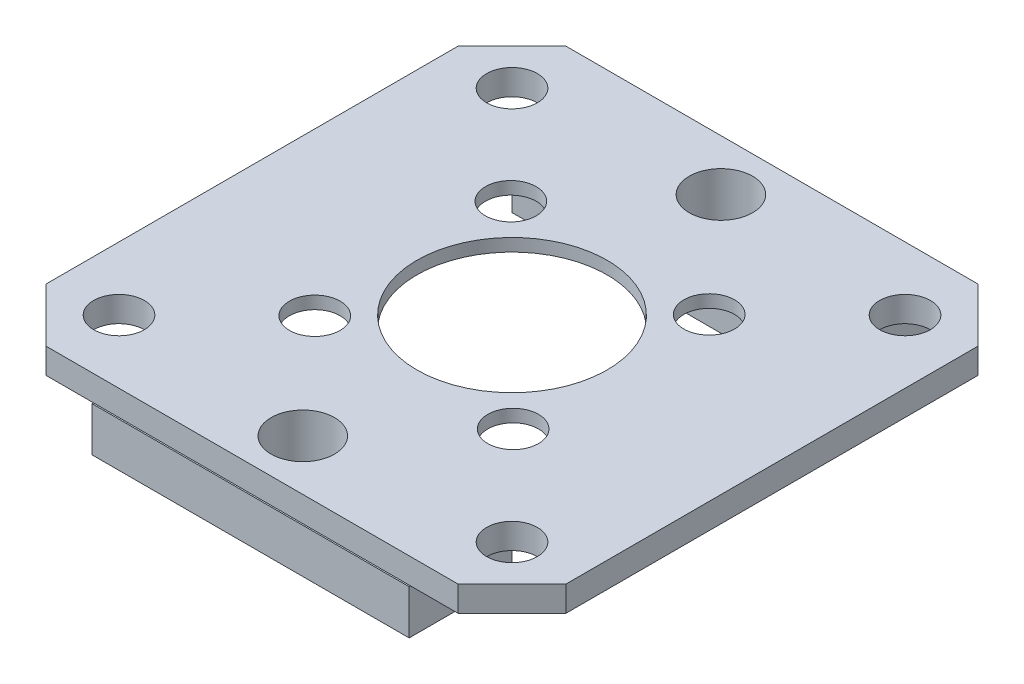
ISO-10303-21;
HEADER;
FILE_DESCRIPTION(('STEP AP214'),'2;1');
FILE_NAME('part.step','',(''),(''),'','','');
FILE_SCHEMA(('AUTOMOTIVE_DESIGN { 1 0 10303 214 1 1 1 1 }'));
ENDSEC;
DATA;
#1=APPLICATION_CONTEXT('core data for automotive mechanical design processes');
#2=APPLICATION_PROTOCOL_DEFINITION('international standard','automotive_design',2000,#1);
#3=PRODUCT_CONTEXT('',#1,'mechanical');
#4=PRODUCT('Part','Part','',(#3));
#5=PRODUCT_RELATED_PRODUCT_CATEGORY('part','',(#4));
#6=PRODUCT_DEFINITION_FORMATION('','',#4);
#7=PRODUCT_DEFINITION_CONTEXT('part definition',#1,'design');
#8=PRODUCT_DEFINITION('design','',#6,#7);
#9=PRODUCT_DEFINITION_SHAPE('','',#8);
#10=(LENGTH_UNIT() NAMED_UNIT(*) SI_UNIT(.MILLI.,.METRE.));
#11=(NAMED_UNIT(*) PLANE_ANGLE_UNIT() SI_UNIT($,.RADIAN.));
#12=(NAMED_UNIT(*) SI_UNIT($,.STERADIAN.) SOLID_ANGLE_UNIT());
#13=UNCERTAINTY_MEASURE_WITH_UNIT(LENGTH_MEASURE(1.E-05),#10,'distance_accuracy_value','');
#14=(GEOMETRIC_REPRESENTATION_CONTEXT(3) GLOBAL_UNCERTAINTY_ASSIGNED_CONTEXT((#13)) GLOBAL_UNIT_ASSIGNED_CONTEXT((#10,
#11,#12)) REPRESENTATION_CONTEXT('',''));
#15=CARTESIAN_POINT('',(0.,0.,0.));
#16=DIRECTION('',(0.,0.,1.));
#17=DIRECTION('',(1.,0.,0.));
#18=AXIS2_PLACEMENT_3D('',#15,#16,#17);
#19=CARTESIAN_POINT('',(0.,0.,0.));
#20=DIRECTION('',(0.,-1.,0.));
#21=DIRECTION('',(0.,0.,-1.));
#22=AXIS2_PLACEMENT_3D('',#19,#20,#21);
#23=PLANE('',#22);
#24=CARTESIAN_POINT('',(-15.5,0.,-15.5));
#25=DIRECTION('',(0.,-1.,0.));
#26=DIRECTION('',(0.,0.,-1.));
#27=AXIS2_PLACEMENT_3D('',#24,#25,#26);
#28=CIRCLE('',#27,2.);
#29=CARTESIAN_POINT('',(-15.5,0.,-17.5));
#30=VERTEX_POINT('',#29);
#31=EDGE_CURVE('E250',#30,#30,#28,.T.);
#32=ORIENTED_EDGE('',*,*,#31,.F.);
#33=EDGE_LOOP('',(#32));
#34=FACE_BOUND('',#33,.T.);
#35=CARTESIAN_POINT('',(15.5,0.,-15.5));
#36=DIRECTION('',(0.,-1.,0.));
#37=DIRECTION('',(0.,0.,-1.));
#38=AXIS2_PLACEMENT_3D('',#35,#36,#37);
#39=CIRCLE('',#38,2.);
#40=CARTESIAN_POINT('',(15.5,0.,-17.5));
#41=VERTEX_POINT('',#40);
#42=EDGE_CURVE('E244',#41,#41,#39,.T.);
#43=ORIENTED_EDGE('',*,*,#42,.F.);
#44=EDGE_LOOP('',(#43));
#45=FACE_BOUND('',#44,.T.);
#46=CARTESIAN_POINT('',(15.5,0.,15.5));
#47=DIRECTION('',(0.,-1.,0.));
#48=DIRECTION('',(0.,0.,-1.));
#49=AXIS2_PLACEMENT_3D('',#46,#47,#48);
#50=CIRCLE('',#49,2.);
#51=CARTESIAN_POINT('',(15.5,0.,13.5));
#52=VERTEX_POINT('',#51);
#53=EDGE_CURVE('E237',#52,#52,#50,.T.);
#54=ORIENTED_EDGE('',*,*,#53,.F.);
#55=EDGE_LOOP('',(#54));
#56=FACE_BOUND('',#55,.T.);
#57=CARTESIAN_POINT('',(-15.5,0.,15.5));
#58=DIRECTION('',(0.,-1.,0.));
#59=DIRECTION('',(0.,0.,-1.));
#60=AXIS2_PLACEMENT_3D('',#57,#58,#59);
#61=CIRCLE('',#60,2.);
#62=CARTESIAN_POINT('',(-15.5,0.,13.5));
#63=VERTEX_POINT('',#62);
#64=EDGE_CURVE('E240',#63,#63,#61,.T.);
#65=ORIENTED_EDGE('',*,*,#64,.F.);
#66=EDGE_LOOP('',(#65));
#67=FACE_BOUND('',#66,.T.);
#68=DIRECTION('',(0.,0.,-1.));
#69=VECTOR('',#68,1.);
#70=CARTESIAN_POINT('',(-12.5,0.,-12.5));
#71=LINE('',#70,#69);
#72=CARTESIAN_POINT('',(-12.5,0.,12.5));
#73=VERTEX_POINT('',#72);
#74=CARTESIAN_POINT('',(-12.5,0.,-12.5));
#75=VERTEX_POINT('',#74);
#76=EDGE_CURVE('E302',#73,#75,#71,.T.);
#77=ORIENTED_EDGE('',*,*,#76,.F.);
#78=DIRECTION('',(0.,0.,-1.));
#79=VECTOR('',#78,1.);
#80=CARTESIAN_POINT('',(-12.5,0.,12.5));
#81=LINE('',#80,#79);
#82=CARTESIAN_POINT('',(-12.5,0.,20.5));
#83=VERTEX_POINT('',#82);
#84=EDGE_CURVE('E197',#83,#73,#81,.T.);
#85=ORIENTED_EDGE('',*,*,#84,.F.);
#86=DIRECTION('',(1.,0.,0.));
#87=VECTOR('',#86,1.);
#88=CARTESIAN_POINT('',(-20.5,0.,20.5));
#89=LINE('',#88,#87);
#90=CARTESIAN_POINT('',(-16.2573593128807,0.,20.5));
#91=VERTEX_POINT('',#90);
#92=EDGE_CURVE('E358',#91,#83,#89,.T.);
#93=ORIENTED_EDGE('',*,*,#92,.F.);
#94=DIRECTION('',(-0.707106781186549,0.,-0.707106781186546));
#95=VECTOR('',#94,1.);
#96=CARTESIAN_POINT('',(-16.2573593128807,0.,20.5));
#97=LINE('',#96,#95);
#98=CARTESIAN_POINT('',(-20.5,0.,16.2573593128807));
#99=VERTEX_POINT('',#98);
#100=EDGE_CURVE('E285',#91,#99,#97,.T.);
#101=ORIENTED_EDGE('',*,*,#100,.T.);
#102=DIRECTION('',(0.,0.,1.));
#103=VECTOR('',#102,1.);
#104=CARTESIAN_POINT('',(-20.5,0.,20.5));
#105=LINE('',#104,#103);
#106=CARTESIAN_POINT('',(-20.5,0.,-16.2573593128807));
#107=VERTEX_POINT('',#106);
#108=EDGE_CURVE('E368',#107,#99,#105,.T.);
#109=ORIENTED_EDGE('',*,*,#108,.F.);
#110=DIRECTION('',(0.707106781186546,0.,-0.707106781186549));
#111=VECTOR('',#110,1.);
#112=CARTESIAN_POINT('',(-20.5,0.,-16.2573593128807));
#113=LINE('',#112,#111);
#114=CARTESIAN_POINT('',(-16.2573593128807,0.,-20.5));
#115=VERTEX_POINT('',#114);
#116=EDGE_CURVE('E291',#107,#115,#113,.T.);
#117=ORIENTED_EDGE('',*,*,#116,.T.);
#118=DIRECTION('',(-1.,0.,0.));
#119=VECTOR('',#118,1.);
#120=CARTESIAN_POINT('',(-20.5,0.,-20.5));
#121=LINE('',#120,#119);
#122=CARTESIAN_POINT('',(16.2573593128807,0.,-20.5));
#123=VERTEX_POINT('',#122);
#124=EDGE_CURVE('E365',#123,#115,#121,.T.);
#125=ORIENTED_EDGE('',*,*,#124,.F.);
#126=DIRECTION('',(0.707106781186549,0.,0.707106781186546));
#127=VECTOR('',#126,1.);
#128=CARTESIAN_POINT('',(16.2573593128807,0.,-20.5));
#129=LINE('',#128,#127);
#130=CARTESIAN_POINT('',(20.5,0.,-16.2573593128807));
#131=VERTEX_POINT('',#130);
#132=EDGE_CURVE('E263',#123,#131,#129,.T.);
#133=ORIENTED_EDGE('',*,*,#132,.T.);
#134=DIRECTION('',(0.,0.,-1.));
#135=VECTOR('',#134,1.);
#136=CARTESIAN_POINT('',(20.5,0.,20.5));
#137=LINE('',#136,#135);
#138=CARTESIAN_POINT('',(20.5,0.,16.2573593128807));
#139=VERTEX_POINT('',#138);
#140=EDGE_CURVE('E353',#139,#131,#137,.T.);
#141=ORIENTED_EDGE('',*,*,#140,.F.);
#142=DIRECTION('',(-0.707106781186546,0.,0.707106781186549));
#143=VECTOR('',#142,1.);
#144=CARTESIAN_POINT('',(20.5,0.,16.2573593128807));
#145=LINE('',#144,#143);
#146=CARTESIAN_POINT('',(16.2573593128807,0.,20.5));
#147=VERTEX_POINT('',#146);
#148=EDGE_CURVE('E275',#139,#147,#145,.T.);
#149=ORIENTED_EDGE('',*,*,#148,.T.);
#150=CARTESIAN_POINT('',(12.5,0.,20.5));
#151=VERTEX_POINT('',#150);
#152=EDGE_CURVE('E370',#151,#147,#89,.T.);
#153=ORIENTED_EDGE('',*,*,#152,.F.);
#154=DIRECTION('',(0.,0.,1.));
#155=VECTOR('',#154,1.);
#156=CARTESIAN_POINT('',(12.5,0.,12.5));
#157=LINE('',#156,#155);
#158=CARTESIAN_POINT('',(12.5,0.,12.5));
#159=VERTEX_POINT('',#158);
#160=EDGE_CURVE('E201',#159,#151,#157,.T.);
#161=ORIENTED_EDGE('',*,*,#160,.F.);
#162=DIRECTION('',(0.,0.,1.));
#163=VECTOR('',#162,1.);
#164=CARTESIAN_POINT('',(12.5,0.,-12.5));
#165=LINE('',#164,#163);
#166=CARTESIAN_POINT('',(12.5,0.,-12.5));
#167=VERTEX_POINT('',#166);
#168=EDGE_CURVE('E296',#167,#159,#165,.T.);
#169=ORIENTED_EDGE('',*,*,#168,.F.);
#170=DIRECTION('',(0.,0.,1.));
#171=VECTOR('',#170,1.);
#172=CARTESIAN_POINT('',(12.5,0.,-12.5));
#173=LINE('',#172,#171);
#174=CARTESIAN_POINT('',(12.5,0.,-20.457817611367));
#175=VERTEX_POINT('',#174);
#176=EDGE_CURVE('E214',#175,#167,#173,.T.);
#177=ORIENTED_EDGE('',*,*,#176,.F.);
#178=DIRECTION('',(1.,0.,0.));
#179=VECTOR('',#178,1.);
#180=CARTESIAN_POINT('',(12.5,0.,-20.457817611367));
#181=LINE('',#180,#179);
#182=CARTESIAN_POINT('',(-12.5,0.,-20.457817611367));
#183=VERTEX_POINT('',#182);
#184=EDGE_CURVE('E54',#183,#175,#181,.T.);
#185=ORIENTED_EDGE('',*,*,#184,.F.);
#186=DIRECTION('',(0.,0.,-1.));
#187=VECTOR('',#186,1.);
#188=CARTESIAN_POINT('',(-12.5,0.,-12.5));
#189=LINE('',#188,#187);
#190=EDGE_CURVE('E199',#75,#183,#189,.T.);
#191=ORIENTED_EDGE('',*,*,#190,.F.);
#192=EDGE_LOOP('',(#77,#85,#93,#101,#109,#117,#125,#133,#141,#149,#153,#161,#169,#177,#185,#191));
#193=FACE_BOUND('',#192,.T.);
#194=ADVANCED_FACE('F37',(#34,#45,#56,#67,#193),#23,.T.);
#195=CARTESIAN_POINT('',(20.5,2.,20.5));
#196=DIRECTION('',(-1.,0.,0.));
#197=DIRECTION('',(0.,0.,1.));
#198=AXIS2_PLACEMENT_3D('',#195,#196,#197);
#199=PLANE('',#198);
#200=DIRECTION('',(0.,0.,-1.));
#201=VECTOR('',#200,1.);
#202=CARTESIAN_POINT('',(20.5,2.,20.5));
#203=LINE('',#202,#201);
#204=CARTESIAN_POINT('',(20.5,2.,16.2573593128807));
#205=VERTEX_POINT('',#204);
#206=CARTESIAN_POINT('',(20.5,2.,-16.2573593128807));
#207=VERTEX_POINT('',#206);
#208=EDGE_CURVE('E354',#205,#207,#203,.T.);
#209=ORIENTED_EDGE('',*,*,#208,.F.);
#210=DIRECTION('',(0.,1.,0.));
#211=VECTOR('',#210,1.);
#212=CARTESIAN_POINT('',(20.5,0.,16.2573593128807));
#213=LINE('',#212,#211);
#214=EDGE_CURVE('E273',#139,#205,#213,.T.);
#215=ORIENTED_EDGE('',*,*,#214,.F.);
#216=ORIENTED_EDGE('',*,*,#140,.T.);
#217=DIRECTION('',(0.,1.,0.));
#218=VECTOR('',#217,1.);
#219=CARTESIAN_POINT('',(20.5,0.,-16.2573593128807));
#220=LINE('',#219,#218);
#221=EDGE_CURVE('E264',#131,#207,#220,.T.);
#222=ORIENTED_EDGE('',*,*,#221,.T.);
#223=EDGE_LOOP('',(#209,#215,#216,#222));
#224=FACE_BOUND('',#223,.T.);
#225=ADVANCED_FACE('F39',(#224),#199,.F.);
#226=CARTESIAN_POINT('',(-20.5,2.,-20.5));
#227=DIRECTION('',(0.,0.,1.));
#228=DIRECTION('',(1.,0.,0.));
#229=AXIS2_PLACEMENT_3D('',#226,#227,#228);
#230=PLANE('',#229);
#231=DIRECTION('',(-1.,0.,0.));
#232=VECTOR('',#231,1.);
#233=CARTESIAN_POINT('',(-20.5,2.,-20.5));
#234=LINE('',#233,#232);
#235=CARTESIAN_POINT('',(16.2573593128807,2.,-20.5));
#236=VERTEX_POINT('',#235);
#237=CARTESIAN_POINT('',(-16.2573593128807,2.,-20.5));
#238=VERTEX_POINT('',#237);
#239=EDGE_CURVE('E357',#236,#238,#234,.T.);
#240=ORIENTED_EDGE('',*,*,#239,.F.);
#241=DIRECTION('',(0.,1.,0.));
#242=VECTOR('',#241,1.);
#243=CARTESIAN_POINT('',(16.2573593128807,0.,-20.5));
#244=LINE('',#243,#242);
#245=EDGE_CURVE('E261',#123,#236,#244,.T.);
#246=ORIENTED_EDGE('',*,*,#245,.F.);
#247=ORIENTED_EDGE('',*,*,#124,.T.);
#248=DIRECTION('',(0.,1.,0.));
#249=VECTOR('',#248,1.);
#250=CARTESIAN_POINT('',(-16.2573593128807,0.,-20.5));
#251=LINE('',#250,#249);
#252=EDGE_CURVE('E62',#115,#238,#251,.T.);
#253=ORIENTED_EDGE('',*,*,#252,.T.);
#254=EDGE_LOOP('',(#240,#246,#247,#253));
#255=FACE_BOUND('',#254,.T.);
#256=ADVANCED_FACE('F490',(#255),#230,.F.);
#257=CARTESIAN_POINT('',(-20.5,2.,20.5));
#258=DIRECTION('',(1.,0.,0.));
#259=DIRECTION('',(0.,0.,-1.));
#260=AXIS2_PLACEMENT_3D('',#257,#258,#259);
#261=PLANE('',#260);
#262=ORIENTED_EDGE('',*,*,#108,.T.);
#263=DIRECTION('',(0.,1.,0.));
#264=VECTOR('',#263,1.);
#265=CARTESIAN_POINT('',(-20.5,0.,16.2573593128807));
#266=LINE('',#265,#264);
#267=CARTESIAN_POINT('',(-20.5,2.,16.2573593128807));
#268=VERTEX_POINT('',#267);
#269=EDGE_CURVE('E258',#99,#268,#266,.T.);
#270=ORIENTED_EDGE('',*,*,#269,.T.);
#271=DIRECTION('',(0.,0.,1.));
#272=VECTOR('',#271,1.);
#273=CARTESIAN_POINT('',(-20.5,2.,20.5));
#274=LINE('',#273,#272);
#275=CARTESIAN_POINT('',(-20.5,2.,-16.2573593128807));
#276=VERTEX_POINT('',#275);
#277=EDGE_CURVE('E46',#276,#268,#274,.T.);
#278=ORIENTED_EDGE('',*,*,#277,.F.);
#279=DIRECTION('',(0.,1.,0.));
#280=VECTOR('',#279,1.);
#281=CARTESIAN_POINT('',(-20.5,0.,-16.2573593128807));
#282=LINE('',#281,#280);
#283=EDGE_CURVE('E293',#107,#276,#282,.T.);
#284=ORIENTED_EDGE('',*,*,#283,.F.);
#285=EDGE_LOOP('',(#262,#270,#278,#284));
#286=FACE_BOUND('',#285,.T.);
#287=ADVANCED_FACE('F480',(#286),#261,.F.);
#288=CARTESIAN_POINT('',(-20.5,2.,20.5));
#289=DIRECTION('',(0.,0.,-1.));
#290=DIRECTION('',(-1.,0.,0.));
#291=AXIS2_PLACEMENT_3D('',#288,#289,#290);
#292=PLANE('',#291);
#293=DIRECTION('',(1.,0.,0.));
#294=VECTOR('',#293,1.);
#295=CARTESIAN_POINT('',(-20.5,2.,20.5));
#296=LINE('',#295,#294);
#297=CARTESIAN_POINT('',(-16.2573593128807,2.,20.5));
#298=VERTEX_POINT('',#297);
#299=CARTESIAN_POINT('',(16.2573593128807,2.,20.5));
#300=VERTEX_POINT('',#299);
#301=EDGE_CURVE('E11',#298,#300,#296,.T.);
#302=ORIENTED_EDGE('',*,*,#301,.F.);
#303=DIRECTION('',(0.,1.,0.));
#304=VECTOR('',#303,1.);
#305=CARTESIAN_POINT('',(-16.2573593128807,0.,20.5));
#306=LINE('',#305,#304);
#307=EDGE_CURVE('E283',#91,#298,#306,.T.);
#308=ORIENTED_EDGE('',*,*,#307,.F.);
#309=ORIENTED_EDGE('',*,*,#92,.T.);
#310=DIRECTION('',(1.,0.,0.));
#311=VECTOR('',#310,1.);
#312=CARTESIAN_POINT('',(-20.5,0.,20.5));
#313=LINE('',#312,#311);
#314=EDGE_CURVE('E196',#83,#151,#313,.T.);
#315=ORIENTED_EDGE('',*,*,#314,.T.);
#316=ORIENTED_EDGE('',*,*,#152,.T.);
#317=DIRECTION('',(0.,1.,0.));
#318=VECTOR('',#317,1.);
#319=CARTESIAN_POINT('',(16.2573593128807,0.,20.5));
#320=LINE('',#319,#318);
#321=EDGE_CURVE('E276',#147,#300,#320,.T.);
#322=ORIENTED_EDGE('',*,*,#321,.T.);
#323=EDGE_LOOP('',(#302,#308,#309,#315,#316,#322));
#324=FACE_BOUND('',#323,.T.);
#325=ADVANCED_FACE('F378',(#324),#292,.F.);
#326=CARTESIAN_POINT('',(0.,2.,0.));
#327=DIRECTION('',(0.,-1.,0.));
#328=DIRECTION('',(0.,0.,-1.));
#329=AXIS2_PLACEMENT_3D('',#326,#327,#328);
#330=PLANE('',#329);
#331=CARTESIAN_POINT('',(0.,2.,16.5));
#332=DIRECTION('',(0.,-1.,0.));
#333=DIRECTION('',(0.,0.,-1.));
#334=AXIS2_PLACEMENT_3D('',#331,#332,#333);
#335=CIRCLE('',#334,2.5);
#336=CARTESIAN_POINT('',(0.,2.,14.));
#337=VERTEX_POINT('',#336);
#338=EDGE_CURVE('E404',#337,#337,#335,.T.);
#339=ORIENTED_EDGE('',*,*,#338,.T.);
#340=EDGE_LOOP('',(#339));
#341=FACE_BOUND('',#340,.T.);
#342=CARTESIAN_POINT('',(0.,2.,-16.4789088056835));
#343=DIRECTION('',(0.,-1.,0.));
#344=DIRECTION('',(0.,0.,-1.));
#345=AXIS2_PLACEMENT_3D('',#342,#343,#344);
#346=CIRCLE('',#345,2.5);
#347=CARTESIAN_POINT('',(0.,2.,-18.9789088056835));
#348=VERTEX_POINT('',#347);
#349=EDGE_CURVE('E411',#348,#348,#346,.T.);
#350=ORIENTED_EDGE('',*,*,#349,.T.);
#351=EDGE_LOOP('',(#350));
#352=FACE_BOUND('',#351,.T.);
#353=CARTESIAN_POINT('',(-15.5,2.,-15.5));
#354=DIRECTION('',(0.,-1.,0.));
#355=DIRECTION('',(0.,0.,-1.));
#356=AXIS2_PLACEMENT_3D('',#353,#354,#355);
#357=CIRCLE('',#356,2.);
#358=CARTESIAN_POINT('',(-15.5,2.,-17.5));
#359=VERTEX_POINT('',#358);
#360=EDGE_CURVE('E236',#359,#359,#357,.T.);
#361=ORIENTED_EDGE('',*,*,#360,.T.);
#362=EDGE_LOOP('',(#361));
#363=FACE_BOUND('',#362,.T.);
#364=CARTESIAN_POINT('',(15.5,2.,-15.5));
#365=DIRECTION('',(0.,-1.,0.));
#366=DIRECTION('',(0.,0.,-1.));
#367=AXIS2_PLACEMENT_3D('',#364,#365,#366);
#368=CIRCLE('',#367,2.);
#369=CARTESIAN_POINT('',(15.5,2.,-17.5));
#370=VERTEX_POINT('',#369);
#371=EDGE_CURVE('E247',#370,#370,#368,.T.);
#372=ORIENTED_EDGE('',*,*,#371,.T.);
#373=EDGE_LOOP('',(#372));
#374=FACE_BOUND('',#373,.T.);
#375=CARTESIAN_POINT('',(15.5,2.,15.5));
#376=DIRECTION('',(0.,-1.,0.));
#377=DIRECTION('',(0.,0.,-1.));
#378=AXIS2_PLACEMENT_3D('',#375,#376,#377);
#379=CIRCLE('',#378,2.);
#380=CARTESIAN_POINT('',(15.5,2.,13.5));
#381=VERTEX_POINT('',#380);
#382=EDGE_CURVE('E241',#381,#381,#379,.T.);
#383=ORIENTED_EDGE('',*,*,#382,.T.);
#384=EDGE_LOOP('',(#383));
#385=FACE_BOUND('',#384,.T.);
#386=CARTESIAN_POINT('',(-15.5,2.,15.5));
#387=DIRECTION('',(0.,-1.,0.));
#388=DIRECTION('',(0.,0.,-1.));
#389=AXIS2_PLACEMENT_3D('',#386,#387,#388);
#390=CIRCLE('',#389,2.);
#391=CARTESIAN_POINT('',(-15.5,2.,13.5));
#392=VERTEX_POINT('',#391);
#393=EDGE_CURVE('E255',#392,#392,#390,.T.);
#394=ORIENTED_EDGE('',*,*,#393,.T.);
#395=EDGE_LOOP('',(#394));
#396=FACE_BOUND('',#395,.T.);
#397=CARTESIAN_POINT('',(0.,2.,0.));
#398=DIRECTION('',(0.,1.,0.));
#399=DIRECTION('',(0.,0.,1.));
#400=AXIS2_PLACEMENT_3D('',#397,#398,#399);
#401=CIRCLE('',#400,7.5);
#402=CARTESIAN_POINT('',(0.,2.,7.5));
#403=VERTEX_POINT('',#402);
#404=EDGE_CURVE('E338',#403,#403,#401,.T.);
#405=ORIENTED_EDGE('',*,*,#404,.F.);
#406=EDGE_LOOP('',(#405));
#407=FACE_BOUND('',#406,.T.);
#408=CARTESIAN_POINT('',(-7.82377924600726,2.,-7.73230097123404));
#409=DIRECTION('',(0.,-1.,0.));
#410=DIRECTION('',(0.,0.,-1.));
#411=AXIS2_PLACEMENT_3D('',#408,#409,#410);
#412=CIRCLE('',#411,2.);
#413=CARTESIAN_POINT('',(-7.82377924600726,2.,-9.73230097123404));
#414=VERTEX_POINT('',#413);
#415=EDGE_CURVE('E341',#414,#414,#412,.T.);
#416=ORIENTED_EDGE('',*,*,#415,.T.);
#417=EDGE_LOOP('',(#416));
#418=FACE_BOUND('',#417,.T.);
#419=CARTESIAN_POINT('',(7.73230097123402,2.,-7.82377924600729));
#420=DIRECTION('',(0.,-1.,0.));
#421=DIRECTION('',(0.,0.,-1.));
#422=AXIS2_PLACEMENT_3D('',#419,#420,#421);
#423=CIRCLE('',#422,2.);
#424=CARTESIAN_POINT('',(7.73230097123402,2.,-9.82377924600729));
#425=VERTEX_POINT('',#424);
#426=EDGE_CURVE('E346',#425,#425,#423,.T.);
#427=ORIENTED_EDGE('',*,*,#426,.T.);
#428=EDGE_LOOP('',(#427));
#429=FACE_BOUND('',#428,.T.);
#430=CARTESIAN_POINT('',(7.82377924600726,2.,7.73230097123398));
#431=DIRECTION('',(0.,-1.,0.));
#432=DIRECTION('',(0.,0.,-1.));
#433=AXIS2_PLACEMENT_3D('',#430,#431,#432);
#434=CIRCLE('',#433,2.);
#435=CARTESIAN_POINT('',(7.82377924600726,2.,5.73230097123398));
#436=VERTEX_POINT('',#435);
#437=EDGE_CURVE('E342',#436,#436,#434,.T.);
#438=ORIENTED_EDGE('',*,*,#437,.T.);
#439=EDGE_LOOP('',(#438));
#440=FACE_BOUND('',#439,.T.);
#441=CARTESIAN_POINT('',(-7.73230097123401,2.,7.82377924600724));
#442=DIRECTION('',(0.,-1.,0.));
#443=DIRECTION('',(0.,0.,-1.));
#444=AXIS2_PLACEMENT_3D('',#441,#442,#443);
#445=CIRCLE('',#444,2.);
#446=CARTESIAN_POINT('',(-7.73230097123401,2.,5.82377924600724));
#447=VERTEX_POINT('',#446);
#448=EDGE_CURVE('E345',#447,#447,#445,.T.);
#449=ORIENTED_EDGE('',*,*,#448,.T.);
#450=EDGE_LOOP('',(#449));
#451=FACE_BOUND('',#450,.T.);
#452=ORIENTED_EDGE('',*,*,#277,.T.);
#453=DIRECTION('',(-0.707106781186549,0.,-0.707106781186546));
#454=VECTOR('',#453,1.);
#455=CARTESIAN_POINT('',(-16.2573593128807,2.,20.5));
#456=LINE('',#455,#454);
#457=EDGE_CURVE('E279',#298,#268,#456,.T.);
#458=ORIENTED_EDGE('',*,*,#457,.F.);
#459=ORIENTED_EDGE('',*,*,#301,.T.);
#460=DIRECTION('',(-0.707106781186546,0.,0.707106781186549));
#461=VECTOR('',#460,1.);
#462=CARTESIAN_POINT('',(20.5,2.,16.2573593128807));
#463=LINE('',#462,#461);
#464=EDGE_CURVE('E267',#205,#300,#463,.T.);
#465=ORIENTED_EDGE('',*,*,#464,.F.);
#466=ORIENTED_EDGE('',*,*,#208,.T.);
#467=DIRECTION('',(0.707106781186549,0.,0.707106781186546));
#468=VECTOR('',#467,1.);
#469=CARTESIAN_POINT('',(16.2573593128807,2.,-20.5));
#470=LINE('',#469,#468);
#471=EDGE_CURVE('E268',#236,#207,#470,.T.);
#472=ORIENTED_EDGE('',*,*,#471,.F.);
#473=ORIENTED_EDGE('',*,*,#239,.T.);
#474=DIRECTION('',(0.707106781186546,0.,-0.707106781186549));
#475=VECTOR('',#474,1.);
#476=CARTESIAN_POINT('',(-20.5,2.,-16.2573593128807));
#477=LINE('',#476,#475);
#478=EDGE_CURVE('E270',#276,#238,#477,.T.);
#479=ORIENTED_EDGE('',*,*,#478,.F.);
#480=EDGE_LOOP('',(#452,#458,#459,#465,#466,#472,#473,#479));
#481=FACE_BOUND('',#480,.T.);
#482=ADVANCED_FACE('F390',(#341,#352,#363,#374,#385,#396,#407,#418,#429,#440,#451,#481),#330,.F.);
#483=CARTESIAN_POINT('',(-7.73230097123401,2.,7.82377924600724));
#484=DIRECTION('',(0.,-1.,0.));
#485=DIRECTION('',(0.,0.,-1.));
#486=AXIS2_PLACEMENT_3D('',#483,#484,#485);
#487=CYLINDRICAL_SURFACE('',#486,2.);
#488=CARTESIAN_POINT('',(-7.73230097123401,1.,7.82377924600724));
#489=DIRECTION('',(0.,1.,0.));
#490=DIRECTION('',(0.,0.,1.));
#491=AXIS2_PLACEMENT_3D('',#488,#489,#490);
#492=CIRCLE('',#491,2.);
#493=CARTESIAN_POINT('',(-7.73230097123401,1.,9.82377924600724));
#494=VERTEX_POINT('',#493);
#495=EDGE_CURVE('E335',#494,#494,#492,.F.);
#496=ORIENTED_EDGE('',*,*,#495,.T.);
#497=EDGE_LOOP('',(#496));
#498=FACE_BOUND('',#497,.T.);
#499=ORIENTED_EDGE('',*,*,#448,.F.);
#500=EDGE_LOOP('',(#499));
#501=FACE_BOUND('',#500,.T.);
#502=ADVANCED_FACE('F465',(#498,#501),#487,.F.);
#503=CARTESIAN_POINT('',(7.82377924600726,2.,7.73230097123398));
#504=DIRECTION('',(0.,-1.,0.));
#505=DIRECTION('',(0.,0.,-1.));
#506=AXIS2_PLACEMENT_3D('',#503,#504,#505);
#507=CYLINDRICAL_SURFACE('',#506,2.);
#508=CARTESIAN_POINT('',(7.82377924600726,1.,7.73230097123398));
#509=DIRECTION('',(0.,1.,0.));
#510=DIRECTION('',(0.,0.,1.));
#511=AXIS2_PLACEMENT_3D('',#508,#509,#510);
#512=CIRCLE('',#511,2.);
#513=CARTESIAN_POINT('',(7.82377924600726,1.,9.73230097123398));
#514=VERTEX_POINT('',#513);
#515=EDGE_CURVE('E332',#514,#514,#512,.F.);
#516=ORIENTED_EDGE('',*,*,#515,.T.);
#517=EDGE_LOOP('',(#516));
#518=FACE_BOUND('',#517,.T.);
#519=ORIENTED_EDGE('',*,*,#437,.F.);
#520=EDGE_LOOP('',(#519));
#521=FACE_BOUND('',#520,.T.);
#522=ADVANCED_FACE('F468',(#518,#521),#507,.F.);
#523=CARTESIAN_POINT('',(7.73230097123402,2.,-7.82377924600729));
#524=DIRECTION('',(0.,-1.,0.));
#525=DIRECTION('',(0.,0.,-1.));
#526=AXIS2_PLACEMENT_3D('',#523,#524,#525);
#527=CYLINDRICAL_SURFACE('',#526,2.);
#528=CARTESIAN_POINT('',(7.73230097123402,1.,-7.82377924600729));
#529=DIRECTION('',(0.,1.,0.));
#530=DIRECTION('',(0.,0.,1.));
#531=AXIS2_PLACEMENT_3D('',#528,#529,#530);
#532=CIRCLE('',#531,2.);
#533=CARTESIAN_POINT('',(7.73230097123402,1.,-5.82377924600729));
#534=VERTEX_POINT('',#533);
#535=EDGE_CURVE('E329',#534,#534,#532,.F.);
#536=ORIENTED_EDGE('',*,*,#535,.T.);
#537=EDGE_LOOP('',(#536));
#538=FACE_BOUND('',#537,.T.);
#539=ORIENTED_EDGE('',*,*,#426,.F.);
#540=EDGE_LOOP('',(#539));
#541=FACE_BOUND('',#540,.T.);
#542=ADVANCED_FACE('F536',(#538,#541),#527,.F.);
#543=CARTESIAN_POINT('',(-7.82377924600726,2.,-7.73230097123404));
#544=DIRECTION('',(0.,-1.,0.));
#545=DIRECTION('',(0.,0.,-1.));
#546=AXIS2_PLACEMENT_3D('',#543,#544,#545);
#547=CYLINDRICAL_SURFACE('',#546,2.);
#548=CARTESIAN_POINT('',(-7.82377924600726,1.,-7.73230097123404));
#549=DIRECTION('',(0.,1.,0.));
#550=DIRECTION('',(0.,0.,1.));
#551=AXIS2_PLACEMENT_3D('',#548,#549,#550);
#552=CIRCLE('',#551,2.);
#553=CARTESIAN_POINT('',(-7.82377924600726,1.,-5.73230097123403));
#554=VERTEX_POINT('',#553);
#555=EDGE_CURVE('E326',#554,#554,#552,.F.);
#556=ORIENTED_EDGE('',*,*,#555,.T.);
#557=EDGE_LOOP('',(#556));
#558=FACE_BOUND('',#557,.T.);
#559=ORIENTED_EDGE('',*,*,#415,.F.);
#560=EDGE_LOOP('',(#559));
#561=FACE_BOUND('',#560,.T.);
#562=ADVANCED_FACE('F532',(#558,#561),#547,.F.);
#563=CARTESIAN_POINT('',(0.,0.,0.));
#564=DIRECTION('',(0.,1.,0.));
#565=DIRECTION('',(0.,0.,1.));
#566=AXIS2_PLACEMENT_3D('',#563,#564,#565);
#567=CYLINDRICAL_SURFACE('',#566,7.5);
#568=CARTESIAN_POINT('',(0.,1.,0.));
#569=DIRECTION('',(0.,1.,0.));
#570=DIRECTION('',(0.,0.,1.));
#571=AXIS2_PLACEMENT_3D('',#568,#569,#570);
#572=CIRCLE('',#571,7.5);
#573=CARTESIAN_POINT('',(0.,1.,7.5));
#574=VERTEX_POINT('',#573);
#575=EDGE_CURVE('E41',#574,#574,#572,.F.);
#576=ORIENTED_EDGE('',*,*,#575,.T.);
#577=EDGE_LOOP('',(#576));
#578=FACE_BOUND('',#577,.T.);
#579=ORIENTED_EDGE('',*,*,#404,.T.);
#580=EDGE_LOOP('',(#579));
#581=FACE_BOUND('',#580,.T.);
#582=ADVANCED_FACE('F455',(#578,#581),#567,.F.);
#583=CARTESIAN_POINT('',(0.,1.,0.));
#584=DIRECTION('',(0.,1.,0.));
#585=DIRECTION('',(0.,0.,1.));
#586=AXIS2_PLACEMENT_3D('',#583,#584,#585);
#587=PLANE('',#586);
#588=ORIENTED_EDGE('',*,*,#515,.F.);
#589=EDGE_LOOP('',(#588));
#590=FACE_BOUND('',#589,.T.);
#591=ORIENTED_EDGE('',*,*,#555,.F.);
#592=EDGE_LOOP('',(#591));
#593=FACE_BOUND('',#592,.T.);
#594=DIRECTION('',(0.,0.,1.));
#595=VECTOR('',#594,1.);
#596=CARTESIAN_POINT('',(12.5,1.,-12.5));
#597=LINE('',#596,#595);
#598=CARTESIAN_POINT('',(12.5,1.,-12.5));
#599=VERTEX_POINT('',#598);
#600=CARTESIAN_POINT('',(12.5,1.,12.5));
#601=VERTEX_POINT('',#600);
#602=EDGE_CURVE('E298',#599,#601,#597,.T.);
#603=ORIENTED_EDGE('',*,*,#602,.T.);
#604=DIRECTION('',(-1.,0.,0.));
#605=VECTOR('',#604,1.);
#606=CARTESIAN_POINT('',(-12.5,1.,12.5));
#607=LINE('',#606,#605);
#608=CARTESIAN_POINT('',(-12.5,1.,12.5));
#609=VERTEX_POINT('',#608);
#610=EDGE_CURVE('E301',#601,#609,#607,.T.);
#611=ORIENTED_EDGE('',*,*,#610,.T.);
#612=DIRECTION('',(0.,0.,-1.));
#613=VECTOR('',#612,1.);
#614=CARTESIAN_POINT('',(-12.5,1.,-12.5));
#615=LINE('',#614,#613);
#616=CARTESIAN_POINT('',(-12.5,1.,-12.5));
#617=VERTEX_POINT('',#616);
#618=EDGE_CURVE('E305',#609,#617,#615,.T.);
#619=ORIENTED_EDGE('',*,*,#618,.T.);
#620=DIRECTION('',(1.,0.,0.));
#621=VECTOR('',#620,1.);
#622=CARTESIAN_POINT('',(-12.5,1.,-12.5));
#623=LINE('',#622,#621);
#624=EDGE_CURVE('E308',#617,#599,#623,.T.);
#625=ORIENTED_EDGE('',*,*,#624,.T.);
#626=EDGE_LOOP('',(#603,#611,#619,#625));
#627=FACE_BOUND('',#626,.T.);
#628=ORIENTED_EDGE('',*,*,#575,.F.);
#629=EDGE_LOOP('',(#628));
#630=FACE_BOUND('',#629,.T.);
#631=ORIENTED_EDGE('',*,*,#535,.F.);
#632=EDGE_LOOP('',(#631));
#633=FACE_BOUND('',#632,.T.);
#634=ORIENTED_EDGE('',*,*,#495,.F.);
#635=EDGE_LOOP('',(#634));
#636=FACE_BOUND('',#635,.T.);
#637=ADVANCED_FACE('F452',(#590,#593,#627,#630,#633,#636),#587,.F.);
#638=CARTESIAN_POINT('',(12.5,1.,-12.5));
#639=DIRECTION('',(1.,0.,0.));
#640=DIRECTION('',(0.,0.,-1.));
#641=AXIS2_PLACEMENT_3D('',#638,#639,#640);
#642=PLANE('',#641);
#643=ORIENTED_EDGE('',*,*,#168,.T.);
#644=DIRECTION('',(0.,-1.,0.));
#645=VECTOR('',#644,1.);
#646=CARTESIAN_POINT('',(12.5,1.,12.5));
#647=LINE('',#646,#645);
#648=EDGE_CURVE('E311',#601,#159,#647,.T.);
#649=ORIENTED_EDGE('',*,*,#648,.F.);
#650=ORIENTED_EDGE('',*,*,#602,.F.);
#651=DIRECTION('',(0.,-1.,0.));
#652=VECTOR('',#651,1.);
#653=CARTESIAN_POINT('',(12.5,1.,-12.5));
#654=LINE('',#653,#652);
#655=EDGE_CURVE('E316',#599,#167,#654,.T.);
#656=ORIENTED_EDGE('',*,*,#655,.T.);
#657=EDGE_LOOP('',(#643,#649,#650,#656));
#658=FACE_BOUND('',#657,.T.);
#659=ADVANCED_FACE('F433',(#658),#642,.F.);
#660=CARTESIAN_POINT('',(-12.5,1.,-12.5));
#661=DIRECTION('',(0.,0.,-1.));
#662=DIRECTION('',(-1.,0.,0.));
#663=AXIS2_PLACEMENT_3D('',#660,#661,#662);
#664=PLANE('',#663);
#665=DIRECTION('',(0.,-1.,0.));
#666=VECTOR('',#665,1.);
#667=CARTESIAN_POINT('',(-12.5,1.,-12.5));
#668=LINE('',#667,#666);
#669=EDGE_CURVE('E318',#617,#75,#668,.T.);
#670=ORIENTED_EDGE('',*,*,#669,.T.);
#671=DIRECTION('',(0.,1.,0.));
#672=VECTOR('',#671,1.);
#673=CARTESIAN_POINT('',(-12.5,-3.5,-12.5));
#674=LINE('',#673,#672);
#675=CARTESIAN_POINT('',(-12.5,-3.5,-12.5));
#676=VERTEX_POINT('',#675);
#677=EDGE_CURVE('E220',#676,#75,#674,.T.);
#678=ORIENTED_EDGE('',*,*,#677,.F.);
#679=DIRECTION('',(-1.,0.,0.));
#680=VECTOR('',#679,1.);
#681=CARTESIAN_POINT('',(12.5,-3.5,-12.5));
#682=LINE('',#681,#680);
#683=CARTESIAN_POINT('',(12.5,-3.5,-12.5));
#684=VERTEX_POINT('',#683);
#685=EDGE_CURVE('E218',#684,#676,#682,.T.);
#686=ORIENTED_EDGE('',*,*,#685,.F.);
#687=DIRECTION('',(0.,1.,0.));
#688=VECTOR('',#687,1.);
#689=CARTESIAN_POINT('',(12.5,-3.5,-12.5));
#690=LINE('',#689,#688);
#691=EDGE_CURVE('E228',#684,#167,#690,.T.);
#692=ORIENTED_EDGE('',*,*,#691,.T.);
#693=ORIENTED_EDGE('',*,*,#655,.F.);
#694=ORIENTED_EDGE('',*,*,#624,.F.);
#695=EDGE_LOOP('',(#670,#678,#686,#692,#693,#694));
#696=FACE_BOUND('',#695,.T.);
#697=ADVANCED_FACE('F437',(#696),#664,.F.);
#698=CARTESIAN_POINT('',(-12.5,1.,-12.5));
#699=DIRECTION('',(-1.,0.,0.));
#700=DIRECTION('',(0.,0.,1.));
#701=AXIS2_PLACEMENT_3D('',#698,#699,#700);
#702=PLANE('',#701);
#703=ORIENTED_EDGE('',*,*,#76,.T.);
#704=ORIENTED_EDGE('',*,*,#669,.F.);
#705=ORIENTED_EDGE('',*,*,#618,.F.);
#706=DIRECTION('',(0.,-1.,0.));
#707=VECTOR('',#706,1.);
#708=CARTESIAN_POINT('',(-12.5,1.,12.5));
#709=LINE('',#708,#707);
#710=EDGE_CURVE('E321',#609,#73,#709,.T.);
#711=ORIENTED_EDGE('',*,*,#710,.T.);
#712=EDGE_LOOP('',(#703,#704,#705,#711));
#713=FACE_BOUND('',#712,.T.);
#714=ADVANCED_FACE('F398',(#713),#702,.F.);
#715=CARTESIAN_POINT('',(-12.5,1.,12.5));
#716=DIRECTION('',(0.,0.,1.));
#717=DIRECTION('',(1.,0.,0.));
#718=AXIS2_PLACEMENT_3D('',#715,#716,#717);
#719=PLANE('',#718);
#720=ORIENTED_EDGE('',*,*,#648,.T.);
#721=DIRECTION('',(0.,1.,0.));
#722=VECTOR('',#721,1.);
#723=CARTESIAN_POINT('',(12.5,-3.5,12.5));
#724=LINE('',#723,#722);
#725=CARTESIAN_POINT('',(12.5,-3.5,12.5));
#726=VERTEX_POINT('',#725);
#727=EDGE_CURVE('E403',#726,#159,#724,.T.);
#728=ORIENTED_EDGE('',*,*,#727,.F.);
#729=DIRECTION('',(1.,0.,0.));
#730=VECTOR('',#729,1.);
#731=CARTESIAN_POINT('',(-12.5,-3.5,12.5));
#732=LINE('',#731,#730);
#733=CARTESIAN_POINT('',(-12.5,-3.5,12.5));
#734=VERTEX_POINT('',#733);
#735=EDGE_CURVE('E207',#734,#726,#732,.T.);
#736=ORIENTED_EDGE('',*,*,#735,.F.);
#737=DIRECTION('',(0.,1.,0.));
#738=VECTOR('',#737,1.);
#739=CARTESIAN_POINT('',(-12.5,-3.5,12.5));
#740=LINE('',#739,#738);
#741=EDGE_CURVE('E395',#734,#73,#740,.T.);
#742=ORIENTED_EDGE('',*,*,#741,.T.);
#743=ORIENTED_EDGE('',*,*,#710,.F.);
#744=ORIENTED_EDGE('',*,*,#610,.F.);
#745=EDGE_LOOP('',(#720,#728,#736,#742,#743,#744));
#746=FACE_BOUND('',#745,.T.);
#747=ADVANCED_FACE('F401',(#746),#719,.F.);
#748=CARTESIAN_POINT('',(-20.5,0.,-16.2573593128807));
#749=DIRECTION('',(0.707106781186549,0.,0.707106781186546));
#750=DIRECTION('',(0.707106781186546,0.,-0.707106781186549));
#751=AXIS2_PLACEMENT_3D('',#748,#749,#750);
#752=PLANE('',#751);
#753=ORIENTED_EDGE('',*,*,#478,.T.);
#754=ORIENTED_EDGE('',*,*,#252,.F.);
#755=ORIENTED_EDGE('',*,*,#116,.F.);
#756=ORIENTED_EDGE('',*,*,#283,.T.);
#757=EDGE_LOOP('',(#753,#754,#755,#756));
#758=FACE_BOUND('',#757,.T.);
#759=ADVANCED_FACE('F507',(#758),#752,.F.);
#760=CARTESIAN_POINT('',(16.2573593128807,0.,-20.5));
#761=DIRECTION('',(-0.707106781186546,0.,0.707106781186549));
#762=DIRECTION('',(0.707106781186549,0.,0.707106781186546));
#763=AXIS2_PLACEMENT_3D('',#760,#761,#762);
#764=PLANE('',#763);
#765=ORIENTED_EDGE('',*,*,#471,.T.);
#766=ORIENTED_EDGE('',*,*,#221,.F.);
#767=ORIENTED_EDGE('',*,*,#132,.F.);
#768=ORIENTED_EDGE('',*,*,#245,.T.);
#769=EDGE_LOOP('',(#765,#766,#767,#768));
#770=FACE_BOUND('',#769,.T.);
#771=ADVANCED_FACE('F505',(#770),#764,.F.);
#772=CARTESIAN_POINT('',(20.5,0.,16.2573593128807));
#773=DIRECTION('',(-0.707106781186549,0.,-0.707106781186546));
#774=DIRECTION('',(-0.707106781186546,0.,0.707106781186549));
#775=AXIS2_PLACEMENT_3D('',#772,#773,#774);
#776=PLANE('',#775);
#777=ORIENTED_EDGE('',*,*,#464,.T.);
#778=ORIENTED_EDGE('',*,*,#321,.F.);
#779=ORIENTED_EDGE('',*,*,#148,.F.);
#780=ORIENTED_EDGE('',*,*,#214,.T.);
#781=EDGE_LOOP('',(#777,#778,#779,#780));
#782=FACE_BOUND('',#781,.T.);
#783=ADVANCED_FACE('F381',(#782),#776,.F.);
#784=CARTESIAN_POINT('',(-16.2573593128807,0.,20.5));
#785=DIRECTION('',(0.707106781186546,0.,-0.707106781186549));
#786=DIRECTION('',(-0.707106781186549,0.,-0.707106781186546));
#787=AXIS2_PLACEMENT_3D('',#784,#785,#786);
#788=PLANE('',#787);
#789=ORIENTED_EDGE('',*,*,#457,.T.);
#790=ORIENTED_EDGE('',*,*,#269,.F.);
#791=ORIENTED_EDGE('',*,*,#100,.F.);
#792=ORIENTED_EDGE('',*,*,#307,.T.);
#793=EDGE_LOOP('',(#789,#790,#791,#792));
#794=FACE_BOUND('',#793,.T.);
#795=ADVANCED_FACE('F513',(#794),#788,.F.);
#796=CARTESIAN_POINT('',(-15.5,2.,15.5));
#797=DIRECTION('',(0.,-1.,0.));
#798=DIRECTION('',(0.,0.,-1.));
#799=AXIS2_PLACEMENT_3D('',#796,#797,#798);
#800=CYLINDRICAL_SURFACE('',#799,2.);
#801=ORIENTED_EDGE('',*,*,#393,.F.);
#802=EDGE_LOOP('',(#801));
#803=FACE_BOUND('',#802,.T.);
#804=ORIENTED_EDGE('',*,*,#64,.T.);
#805=EDGE_LOOP('',(#804));
#806=FACE_BOUND('',#805,.T.);
#807=ADVANCED_FACE('F517',(#803,#806),#800,.F.);
#808=CARTESIAN_POINT('',(15.5,2.,15.5));
#809=DIRECTION('',(0.,-1.,0.));
#810=DIRECTION('',(0.,0.,-1.));
#811=AXIS2_PLACEMENT_3D('',#808,#809,#810);
#812=CYLINDRICAL_SURFACE('',#811,2.);
#813=ORIENTED_EDGE('',*,*,#382,.F.);
#814=EDGE_LOOP('',(#813));
#815=FACE_BOUND('',#814,.T.);
#816=ORIENTED_EDGE('',*,*,#53,.T.);
#817=EDGE_LOOP('',(#816));
#818=FACE_BOUND('',#817,.T.);
#819=ADVANCED_FACE('F619',(#815,#818),#812,.F.);
#820=CARTESIAN_POINT('',(15.5,2.,-15.5));
#821=DIRECTION('',(0.,-1.,0.));
#822=DIRECTION('',(0.,0.,-1.));
#823=AXIS2_PLACEMENT_3D('',#820,#821,#822);
#824=CYLINDRICAL_SURFACE('',#823,2.);
#825=ORIENTED_EDGE('',*,*,#371,.F.);
#826=EDGE_LOOP('',(#825));
#827=FACE_BOUND('',#826,.T.);
#828=ORIENTED_EDGE('',*,*,#42,.T.);
#829=EDGE_LOOP('',(#828));
#830=FACE_BOUND('',#829,.T.);
#831=ADVANCED_FACE('F629',(#827,#830),#824,.F.);
#832=CARTESIAN_POINT('',(-15.5,2.,-15.5));
#833=DIRECTION('',(0.,-1.,0.));
#834=DIRECTION('',(0.,0.,-1.));
#835=AXIS2_PLACEMENT_3D('',#832,#833,#834);
#836=CYLINDRICAL_SURFACE('',#835,2.);
#837=ORIENTED_EDGE('',*,*,#360,.F.);
#838=EDGE_LOOP('',(#837));
#839=FACE_BOUND('',#838,.T.);
#840=ORIENTED_EDGE('',*,*,#31,.T.);
#841=EDGE_LOOP('',(#840));
#842=FACE_BOUND('',#841,.T.);
#843=ADVANCED_FACE('F639',(#839,#842),#836,.F.);
#844=CARTESIAN_POINT('',(-12.5,-3.5,-12.5));
#845=DIRECTION('',(1.,0.,0.));
#846=DIRECTION('',(0.,0.,-1.));
#847=AXIS2_PLACEMENT_3D('',#844,#845,#846);
#848=PLANE('',#847);
#849=ORIENTED_EDGE('',*,*,#190,.T.);
#850=DIRECTION('',(0.,1.,0.));
#851=VECTOR('',#850,1.);
#852=CARTESIAN_POINT('',(-12.5,-3.5,-20.457817611367));
#853=LINE('',#852,#851);
#854=CARTESIAN_POINT('',(-12.5,-3.5,-20.457817611367));
#855=VERTEX_POINT('',#854);
#856=EDGE_CURVE('E234',#855,#183,#853,.T.);
#857=ORIENTED_EDGE('',*,*,#856,.F.);
#858=DIRECTION('',(0.,0.,-1.));
#859=VECTOR('',#858,1.);
#860=CARTESIAN_POINT('',(-12.5,-3.5,-12.5));
#861=LINE('',#860,#859);
#862=EDGE_CURVE('E210',#676,#855,#861,.T.);
#863=ORIENTED_EDGE('',*,*,#862,.F.);
#864=ORIENTED_EDGE('',*,*,#677,.T.);
#865=EDGE_LOOP('',(#849,#857,#863,#864));
#866=FACE_BOUND('',#865,.T.);
#867=ADVANCED_FACE('F450',(#866),#848,.F.);
#868=CARTESIAN_POINT('',(12.5,-3.5,-20.457817611367));
#869=DIRECTION('',(0.,0.,1.));
#870=DIRECTION('',(1.,0.,0.));
#871=AXIS2_PLACEMENT_3D('',#868,#869,#870);
#872=PLANE('',#871);
#873=ORIENTED_EDGE('',*,*,#184,.T.);
#874=DIRECTION('',(0.,1.,0.));
#875=VECTOR('',#874,1.);
#876=CARTESIAN_POINT('',(12.5,-3.5,-20.457817611367));
#877=LINE('',#876,#875);
#878=CARTESIAN_POINT('',(12.5,-3.5,-20.457817611367));
#879=VERTEX_POINT('',#878);
#880=EDGE_CURVE('E231',#879,#175,#877,.T.);
#881=ORIENTED_EDGE('',*,*,#880,.F.);
#882=DIRECTION('',(1.,0.,0.));
#883=VECTOR('',#882,1.);
#884=CARTESIAN_POINT('',(12.5,-3.5,-20.457817611367));
#885=LINE('',#884,#883);
#886=EDGE_CURVE('E213',#855,#879,#885,.T.);
#887=ORIENTED_EDGE('',*,*,#886,.F.);
#888=ORIENTED_EDGE('',*,*,#856,.T.);
#889=EDGE_LOOP('',(#873,#881,#887,#888));
#890=FACE_BOUND('',#889,.T.);
#891=ADVANCED_FACE('F446',(#890),#872,.F.);
#892=CARTESIAN_POINT('',(12.5,-3.5,-12.5));
#893=DIRECTION('',(-1.,0.,0.));
#894=DIRECTION('',(0.,0.,1.));
#895=AXIS2_PLACEMENT_3D('',#892,#893,#894);
#896=PLANE('',#895);
#897=ORIENTED_EDGE('',*,*,#176,.T.);
#898=ORIENTED_EDGE('',*,*,#691,.F.);
#899=DIRECTION('',(0.,0.,1.));
#900=VECTOR('',#899,1.);
#901=CARTESIAN_POINT('',(12.5,-3.5,-12.5));
#902=LINE('',#901,#900);
#903=EDGE_CURVE('E216',#879,#684,#902,.T.);
#904=ORIENTED_EDGE('',*,*,#903,.F.);
#905=ORIENTED_EDGE('',*,*,#880,.T.);
#906=EDGE_LOOP('',(#897,#898,#904,#905));
#907=FACE_BOUND('',#906,.T.);
#908=ADVANCED_FACE('F443',(#907),#896,.F.);
#909=CARTESIAN_POINT('',(0.,-3.5,0.));
#910=DIRECTION('',(0.,1.,0.));
#911=DIRECTION('',(0.,0.,1.));
#912=AXIS2_PLACEMENT_3D('',#909,#910,#911);
#913=PLANE('',#912);
#914=CARTESIAN_POINT('',(0.,-3.5,-16.4789088056835));
#915=DIRECTION('',(0.,-1.,0.));
#916=DIRECTION('',(0.,0.,-1.));
#917=AXIS2_PLACEMENT_3D('',#914,#915,#916);
#918=CIRCLE('',#917,2.5);
#919=CARTESIAN_POINT('',(0.,-3.5,-18.9789088056835));
#920=VERTEX_POINT('',#919);
#921=EDGE_CURVE('E415',#920,#920,#918,.T.);
#922=ORIENTED_EDGE('',*,*,#921,.F.);
#923=EDGE_LOOP('',(#922));
#924=FACE_BOUND('',#923,.T.);
#925=ORIENTED_EDGE('',*,*,#862,.T.);
#926=ORIENTED_EDGE('',*,*,#886,.T.);
#927=ORIENTED_EDGE('',*,*,#903,.T.);
#928=ORIENTED_EDGE('',*,*,#685,.T.);
#929=EDGE_LOOP('',(#925,#926,#927,#928));
#930=FACE_BOUND('',#929,.T.);
#931=ADVANCED_FACE('F681',(#924,#930),#913,.F.);
#932=CARTESIAN_POINT('',(0.,0.,0.));
#933=DIRECTION('',(0.,1.,0.));
#934=DIRECTION('',(0.,0.,1.));
#935=AXIS2_PLACEMENT_3D('',#932,#933,#934);
#936=PLANE('',#935);
#937=ORIENTED_EDGE('',*,*,#314,.F.);
#938=CARTESIAN_POINT('',(-12.5,0.,20.6110362709));
#939=VERTEX_POINT('',#938);
#940=EDGE_CURVE('E188',#939,#83,#81,.T.);
#941=ORIENTED_EDGE('',*,*,#940,.F.);
#942=DIRECTION('',(-1.,0.,0.));
#943=VECTOR('',#942,1.);
#944=CARTESIAN_POINT('',(-12.5,0.,20.6110362709));
#945=LINE('',#944,#943);
#946=CARTESIAN_POINT('',(12.5,0.,20.6110362709));
#947=VERTEX_POINT('',#946);
#948=EDGE_CURVE('E171',#947,#939,#945,.T.);
#949=ORIENTED_EDGE('',*,*,#948,.F.);
#950=EDGE_CURVE('E181',#151,#947,#157,.T.);
#951=ORIENTED_EDGE('',*,*,#950,.F.);
#952=EDGE_LOOP('',(#937,#941,#949,#951));
#953=FACE_BOUND('',#952,.T.);
#954=ADVANCED_FACE('F194',(#953),#936,.T.);
#955=CARTESIAN_POINT('',(-12.5,-3.5,12.5));
#956=DIRECTION('',(1.,0.,0.));
#957=DIRECTION('',(0.,0.,-1.));
#958=AXIS2_PLACEMENT_3D('',#955,#956,#957);
#959=PLANE('',#958);
#960=ORIENTED_EDGE('',*,*,#940,.T.);
#961=ORIENTED_EDGE('',*,*,#84,.T.);
#962=ORIENTED_EDGE('',*,*,#741,.F.);
#963=DIRECTION('',(0.,0.,-1.));
#964=VECTOR('',#963,1.);
#965=CARTESIAN_POINT('',(-12.5,-3.5,12.5));
#966=LINE('',#965,#964);
#967=CARTESIAN_POINT('',(-12.5,-3.5,20.6110362709));
#968=VERTEX_POINT('',#967);
#969=EDGE_CURVE('E182',#968,#734,#966,.T.);
#970=ORIENTED_EDGE('',*,*,#969,.F.);
#971=DIRECTION('',(0.,1.,0.));
#972=VECTOR('',#971,1.);
#973=CARTESIAN_POINT('',(-12.5,-3.5,20.6110362709));
#974=LINE('',#973,#972);
#975=EDGE_CURVE('E175',#968,#939,#974,.T.);
#976=ORIENTED_EDGE('',*,*,#975,.T.);
#977=EDGE_LOOP('',(#960,#961,#962,#970,#976));
#978=FACE_BOUND('',#977,.T.);
#979=ADVANCED_FACE('F186',(#978),#959,.F.);
#980=CARTESIAN_POINT('',(12.5,-3.5,12.5));
#981=DIRECTION('',(-1.,0.,0.));
#982=DIRECTION('',(0.,0.,1.));
#983=AXIS2_PLACEMENT_3D('',#980,#981,#982);
#984=PLANE('',#983);
#985=ORIENTED_EDGE('',*,*,#160,.T.);
#986=ORIENTED_EDGE('',*,*,#950,.T.);
#987=DIRECTION('',(0.,1.,0.));
#988=VECTOR('',#987,1.);
#989=CARTESIAN_POINT('',(12.5,-3.5,20.6110362709));
#990=LINE('',#989,#988);
#991=CARTESIAN_POINT('',(12.5,-3.5,20.6110362709));
#992=VERTEX_POINT('',#991);
#993=EDGE_CURVE('E178',#992,#947,#990,.T.);
#994=ORIENTED_EDGE('',*,*,#993,.F.);
#995=DIRECTION('',(0.,0.,1.));
#996=VECTOR('',#995,1.);
#997=CARTESIAN_POINT('',(12.5,-3.5,12.5));
#998=LINE('',#997,#996);
#999=EDGE_CURVE('E205',#726,#992,#998,.T.);
#1000=ORIENTED_EDGE('',*,*,#999,.F.);
#1001=ORIENTED_EDGE('',*,*,#727,.T.);
#1002=EDGE_LOOP('',(#985,#986,#994,#1000,#1001));
#1003=FACE_BOUND('',#1002,.T.);
#1004=ADVANCED_FACE('F430',(#1003),#984,.F.);
#1005=CARTESIAN_POINT('',(-12.5,-3.5,20.6110362709));
#1006=DIRECTION('',(0.,0.,-1.));
#1007=DIRECTION('',(-1.,0.,0.));
#1008=AXIS2_PLACEMENT_3D('',#1005,#1006,#1007);
#1009=PLANE('',#1008);
#1010=ORIENTED_EDGE('',*,*,#948,.T.);
#1011=ORIENTED_EDGE('',*,*,#975,.F.);
#1012=DIRECTION('',(-1.,0.,0.));
#1013=VECTOR('',#1012,1.);
#1014=CARTESIAN_POINT('',(-12.5,-3.5,20.6110362709));
#1015=LINE('',#1014,#1013);
#1016=EDGE_CURVE('E192',#992,#968,#1015,.T.);
#1017=ORIENTED_EDGE('',*,*,#1016,.F.);
#1018=ORIENTED_EDGE('',*,*,#993,.T.);
#1019=EDGE_LOOP('',(#1010,#1011,#1017,#1018));
#1020=FACE_BOUND('',#1019,.T.);
#1021=ADVANCED_FACE('F173',(#1020),#1009,.F.);
#1022=CARTESIAN_POINT('',(0.,-3.5,0.));
#1023=DIRECTION('',(0.,1.,0.));
#1024=DIRECTION('',(0.,0.,1.));
#1025=AXIS2_PLACEMENT_3D('',#1022,#1023,#1024);
#1026=PLANE('',#1025);
#1027=CARTESIAN_POINT('',(0.,-3.5,16.5));
#1028=DIRECTION('',(0.,-1.,0.));
#1029=DIRECTION('',(0.,0.,-1.));
#1030=AXIS2_PLACEMENT_3D('',#1027,#1028,#1029);
#1031=CIRCLE('',#1030,2.5);
#1032=CARTESIAN_POINT('',(0.,-3.5,14.));
#1033=VERTEX_POINT('',#1032);
#1034=EDGE_CURVE('E408',#1033,#1033,#1031,.T.);
#1035=ORIENTED_EDGE('',*,*,#1034,.F.);
#1036=EDGE_LOOP('',(#1035));
#1037=FACE_BOUND('',#1036,.T.);
#1038=ORIENTED_EDGE('',*,*,#969,.T.);
#1039=ORIENTED_EDGE('',*,*,#735,.T.);
#1040=ORIENTED_EDGE('',*,*,#999,.T.);
#1041=ORIENTED_EDGE('',*,*,#1016,.T.);
#1042=EDGE_LOOP('',(#1038,#1039,#1040,#1041));
#1043=FACE_BOUND('',#1042,.T.);
#1044=ADVANCED_FACE('F423',(#1037,#1043),#1026,.F.);
#1045=CARTESIAN_POINT('',(0.,2.,16.5));
#1046=DIRECTION('',(0.,-1.,0.));
#1047=DIRECTION('',(0.,0.,-1.));
#1048=AXIS2_PLACEMENT_3D('',#1045,#1046,#1047);
#1049=CYLINDRICAL_SURFACE('',#1048,2.5);
#1050=ORIENTED_EDGE('',*,*,#338,.F.);
#1051=EDGE_LOOP('',(#1050));
#1052=FACE_BOUND('',#1051,.T.);
#1053=ORIENTED_EDGE('',*,*,#1034,.T.);
#1054=EDGE_LOOP('',(#1053));
#1055=FACE_BOUND('',#1054,.T.);
#1056=ADVANCED_FACE('F421',(#1052,#1055),#1049,.F.);
#1057=CARTESIAN_POINT('',(0.,2.,-16.4789088056835));
#1058=DIRECTION('',(0.,-1.,0.));
#1059=DIRECTION('',(0.,0.,-1.));
#1060=AXIS2_PLACEMENT_3D('',#1057,#1058,#1059);
#1061=CYLINDRICAL_SURFACE('',#1060,2.5);
#1062=ORIENTED_EDGE('',*,*,#349,.F.);
#1063=EDGE_LOOP('',(#1062));
#1064=FACE_BOUND('',#1063,.T.);
#1065=ORIENTED_EDGE('',*,*,#921,.T.);
#1066=EDGE_LOOP('',(#1065));
#1067=FACE_BOUND('',#1066,.T.);
#1068=ADVANCED_FACE('F728',(#1064,#1067),#1061,.F.);
#1069=CLOSED_SHELL('',(#194,#225,#256,#287,#325,#482,#502,#522,#542,#562,#582,#637,#659,#697,
#714,#747,#759,#771,#783,#795,#807,#819,#831,#843,#867,#891,#908,#931,#954,#979,#1004,#1021,
#1044,#1056,#1068));
#1070=MANIFOLD_SOLID_BREP('B2',#1069);
#1071=ADVANCED_BREP_SHAPE_REPRESENTATION('',(#18,#1070),#14);
#1072=SHAPE_DEFINITION_REPRESENTATION(#9,#1071);
ENDSEC;
END-ISO-10303-21;
